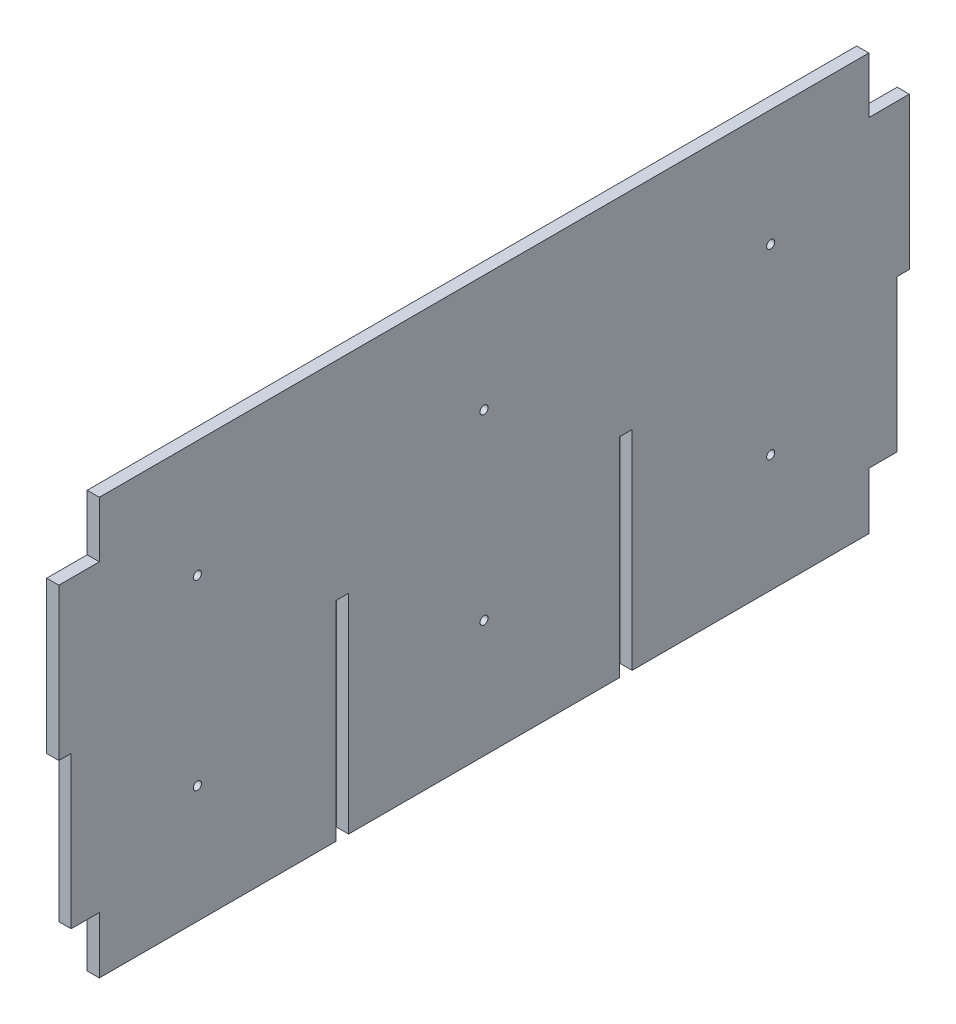
ISO-10303-21;
HEADER;
FILE_DESCRIPTION(('STEP AP214'),'2;1');
FILE_NAME('part.step','',(''),(''),'','','');
FILE_SCHEMA(('AUTOMOTIVE_DESIGN { 1 0 10303 214 1 1 1 1 }'));
ENDSEC;
DATA;
#1=APPLICATION_CONTEXT('core data for automotive mechanical design processes');
#2=APPLICATION_PROTOCOL_DEFINITION('international standard','automotive_design',2000,#1);
#3=PRODUCT_CONTEXT('',#1,'mechanical');
#4=PRODUCT('Part','Part','',(#3));
#5=PRODUCT_RELATED_PRODUCT_CATEGORY('part','',(#4));
#6=PRODUCT_DEFINITION_FORMATION('','',#4);
#7=PRODUCT_DEFINITION_CONTEXT('part definition',#1,'design');
#8=PRODUCT_DEFINITION('design','',#6,#7);
#9=PRODUCT_DEFINITION_SHAPE('','',#8);
#10=(LENGTH_UNIT() NAMED_UNIT(*) SI_UNIT(.MILLI.,.METRE.));
#11=(NAMED_UNIT(*) PLANE_ANGLE_UNIT() SI_UNIT($,.RADIAN.));
#12=(NAMED_UNIT(*) SI_UNIT($,.STERADIAN.) SOLID_ANGLE_UNIT());
#13=UNCERTAINTY_MEASURE_WITH_UNIT(LENGTH_MEASURE(1.E-05),#10,'distance_accuracy_value','');
#14=(GEOMETRIC_REPRESENTATION_CONTEXT(3) GLOBAL_UNCERTAINTY_ASSIGNED_CONTEXT((#13)) GLOBAL_UNIT_ASSIGNED_CONTEXT((#10,
#11,#12)) REPRESENTATION_CONTEXT('',''));
#15=CARTESIAN_POINT('',(0.,0.,0.));
#16=DIRECTION('',(0.,0.,1.));
#17=DIRECTION('',(1.,0.,0.));
#18=AXIS2_PLACEMENT_3D('',#15,#16,#17);
#19=CARTESIAN_POINT('',(6.,76.915861829284,-230.911700257926));
#20=DIRECTION('',(0.,0.,-1.));
#21=DIRECTION('',(-1.,0.,0.));
#22=AXIS2_PLACEMENT_3D('',#19,#20,#21);
#23=PLANE('',#22);
#24=DIRECTION('',(0.,-1.,0.));
#25=VECTOR('',#24,1.);
#26=CARTESIAN_POINT('',(6.,76.915861829284,-230.911700257926));
#27=LINE('',#26,#25);
#28=CARTESIAN_POINT('',(6.,236.915861829284,-230.911700257926));
#29=VERTEX_POINT('',#28);
#30=CARTESIAN_POINT('',(6.,161.915861829284,-230.911700257926));
#31=VERTEX_POINT('',#30);
#32=EDGE_CURVE('E282',#29,#31,#27,.T.);
#33=ORIENTED_EDGE('',*,*,#32,.F.);
#34=DIRECTION('',(1.,0.,0.));
#35=VECTOR('',#34,1.);
#36=CARTESIAN_POINT('',(-994.,236.915861829284,-230.911700257926));
#37=LINE('',#36,#35);
#38=CARTESIAN_POINT('',(0.,236.915861829284,-230.911700257926));
#39=VERTEX_POINT('',#38);
#40=EDGE_CURVE('E239',#39,#29,#37,.T.);
#41=ORIENTED_EDGE('',*,*,#40,.F.);
#42=DIRECTION('',(0.,-1.,0.));
#43=VECTOR('',#42,1.);
#44=CARTESIAN_POINT('',(0.,76.915861829284,-230.911700257926));
#45=LINE('',#44,#43);
#46=CARTESIAN_POINT('',(0.,161.915861829284,-230.911700257926));
#47=VERTEX_POINT('',#46);
#48=EDGE_CURVE('E262',#39,#47,#45,.T.);
#49=ORIENTED_EDGE('',*,*,#48,.T.);
#50=DIRECTION('',(1.,0.,0.));
#51=VECTOR('',#50,1.);
#52=CARTESIAN_POINT('',(0.,161.915861829284,-230.911700257926));
#53=LINE('',#52,#51);
#54=EDGE_CURVE('E277',#47,#31,#53,.T.);
#55=ORIENTED_EDGE('',*,*,#54,.T.);
#56=EDGE_LOOP('',(#33,#41,#49,#55));
#57=FACE_BOUND('',#56,.T.);
#58=ADVANCED_FACE('F32',(#57),#23,.F.);
#59=CARTESIAN_POINT('',(6.,76.915861829284,-650.911700257926));
#60=DIRECTION('',(0.,0.,1.));
#61=DIRECTION('',(1.,0.,0.));
#62=AXIS2_PLACEMENT_3D('',#59,#60,#61);
#63=PLANE('',#62);
#64=DIRECTION('',(0.,1.,0.));
#65=VECTOR('',#64,1.);
#66=CARTESIAN_POINT('',(0.,76.915861829284,-650.911700257926));
#67=LINE('',#66,#65);
#68=CARTESIAN_POINT('',(0.,161.915861829284,-650.911700257926));
#69=VERTEX_POINT('',#68);
#70=CARTESIAN_POINT('',(0.,236.915861829284,-650.911700257926));
#71=VERTEX_POINT('',#70);
#72=EDGE_CURVE('E273',#69,#71,#67,.T.);
#73=ORIENTED_EDGE('',*,*,#72,.T.);
#74=DIRECTION('',(1.,0.,0.));
#75=VECTOR('',#74,1.);
#76=CARTESIAN_POINT('',(-994.,236.915861829284,-650.911700257926));
#77=LINE('',#76,#75);
#78=CARTESIAN_POINT('',(6.,236.915861829284,-650.911700257926));
#79=VERTEX_POINT('',#78);
#80=EDGE_CURVE('E210',#71,#79,#77,.T.);
#81=ORIENTED_EDGE('',*,*,#80,.T.);
#82=DIRECTION('',(0.,1.,0.));
#83=VECTOR('',#82,1.);
#84=CARTESIAN_POINT('',(6.,76.915861829284,-650.911700257926));
#85=LINE('',#84,#83);
#86=CARTESIAN_POINT('',(6.,161.915861829284,-650.911700257926));
#87=VERTEX_POINT('',#86);
#88=EDGE_CURVE('E216',#87,#79,#85,.T.);
#89=ORIENTED_EDGE('',*,*,#88,.F.);
#90=DIRECTION('',(1.,0.,0.));
#91=VECTOR('',#90,1.);
#92=CARTESIAN_POINT('',(0.,161.915861829284,-650.911700257926));
#93=LINE('',#92,#91);
#94=EDGE_CURVE('E304',#69,#87,#93,.T.);
#95=ORIENTED_EDGE('',*,*,#94,.F.);
#96=EDGE_LOOP('',(#73,#81,#89,#95));
#97=FACE_BOUND('',#96,.T.);
#98=ADVANCED_FACE('F483',(#97),#63,.F.);
#99=CARTESIAN_POINT('',(6.,0.,0.));
#100=DIRECTION('',(-1.,0.,0.));
#101=DIRECTION('',(0.,0.,1.));
#102=AXIS2_PLACEMENT_3D('',#99,#100,#101);
#103=PLANE('',#102);
#104=DIRECTION('',(0.,0.,-1.));
#105=VECTOR('',#104,1.);
#106=CARTESIAN_POINT('',(6.,236.915861829284,-630.911700257926));
#107=LINE('',#106,#105);
#108=CARTESIAN_POINT('',(6.,236.915861829284,-630.911700257926));
#109=VERTEX_POINT('',#108);
#110=EDGE_CURVE('E207',#109,#79,#107,.T.);
#111=ORIENTED_EDGE('',*,*,#110,.F.);
#112=DIRECTION('',(0.,-1.,0.));
#113=VECTOR('',#112,1.);
#114=CARTESIAN_POINT('',(6.,274.915861829284,-630.911700257926));
#115=LINE('',#114,#113);
#116=CARTESIAN_POINT('',(6.,264.515338882501,-630.911700257926));
#117=VERTEX_POINT('',#116);
#118=EDGE_CURVE('E194',#117,#109,#115,.T.);
#119=ORIENTED_EDGE('',*,*,#118,.F.);
#120=DIRECTION('',(0.,0.,1.));
#121=VECTOR('',#120,1.);
#122=CARTESIAN_POINT('',(6.,264.515338882501,-1250.91170025793));
#123=LINE('',#122,#121);
#124=CARTESIAN_POINT('',(6.,264.515338882501,-250.911700257926));
#125=VERTEX_POINT('',#124);
#126=EDGE_CURVE('E276',#117,#125,#123,.T.);
#127=ORIENTED_EDGE('',*,*,#126,.T.);
#128=DIRECTION('',(0.,-1.,0.));
#129=VECTOR('',#128,1.);
#130=CARTESIAN_POINT('',(6.,274.915861829284,-250.911700257926));
#131=LINE('',#130,#129);
#132=CARTESIAN_POINT('',(6.,236.915861829284,-250.911700257926));
#133=VERTEX_POINT('',#132);
#134=EDGE_CURVE('E284',#125,#133,#131,.T.);
#135=ORIENTED_EDGE('',*,*,#134,.T.);
#136=DIRECTION('',(0.,0.,-1.));
#137=VECTOR('',#136,1.);
#138=CARTESIAN_POINT('',(6.,236.915861829284,-230.911700257926));
#139=LINE('',#138,#137);
#140=EDGE_CURVE('E236',#29,#133,#139,.T.);
#141=ORIENTED_EDGE('',*,*,#140,.F.);
#142=ORIENTED_EDGE('',*,*,#32,.T.);
#143=DIRECTION('',(0.,0.,1.));
#144=VECTOR('',#143,1.);
#145=CARTESIAN_POINT('',(6.,161.915861829284,-230.911700257926));
#146=LINE('',#145,#144);
#147=CARTESIAN_POINT('',(6.,161.915861829284,-237.011700257926));
#148=VERTEX_POINT('',#147);
#149=EDGE_CURVE('E289',#148,#31,#146,.T.);
#150=ORIENTED_EDGE('',*,*,#149,.F.);
#151=DIRECTION('',(0.,1.,0.));
#152=VECTOR('',#151,1.);
#153=CARTESIAN_POINT('',(6.,161.915861829284,-237.011700257926));
#154=LINE('',#153,#152);
#155=CARTESIAN_POINT('',(6.,86.915861829284,-237.011700257926));
#156=VERTEX_POINT('',#155);
#157=EDGE_CURVE('E288',#156,#148,#154,.T.);
#158=ORIENTED_EDGE('',*,*,#157,.F.);
#159=DIRECTION('',(0.,0.,1.));
#160=VECTOR('',#159,1.);
#161=CARTESIAN_POINT('',(6.,86.915861829284,-237.011700257926));
#162=LINE('',#161,#160);
#163=CARTESIAN_POINT('',(6.,86.915861829284,-250.911700257926));
#164=VERTEX_POINT('',#163);
#165=EDGE_CURVE('E220',#164,#156,#162,.T.);
#166=ORIENTED_EDGE('',*,*,#165,.F.);
#167=DIRECTION('',(0.,1.,0.));
#168=VECTOR('',#167,1.);
#169=CARTESIAN_POINT('',(6.,46.915861829284,-250.911700257926));
#170=LINE('',#169,#168);
#171=CARTESIAN_POINT('',(6.,58.9158618292841,-250.911700257926));
#172=VERTEX_POINT('',#171);
#173=EDGE_CURVE('E341',#172,#164,#170,.T.);
#174=ORIENTED_EDGE('',*,*,#173,.F.);
#175=DIRECTION('',(0.,0.,1.));
#176=VECTOR('',#175,1.);
#177=CARTESIAN_POINT('',(6.,58.9158618292841,-1250.91170025793));
#178=LINE('',#177,#176);
#179=CARTESIAN_POINT('',(6.,58.9158618292841,-367.811700257926));
#180=VERTEX_POINT('',#179);
#181=EDGE_CURVE('E246',#180,#172,#178,.T.);
#182=ORIENTED_EDGE('',*,*,#181,.F.);
#183=DIRECTION('',(0.,-1.,0.));
#184=VECTOR('',#183,1.);
#185=CARTESIAN_POINT('',(6.,48.915861829284,-367.811700257926));
#186=LINE('',#185,#184);
#187=CARTESIAN_POINT('',(6.,161.915861829284,-367.811700257926));
#188=VERTEX_POINT('',#187);
#189=EDGE_CURVE('E272',#188,#180,#186,.T.);
#190=ORIENTED_EDGE('',*,*,#189,.F.);
#191=DIRECTION('',(0.,0.,1.));
#192=VECTOR('',#191,1.);
#193=CARTESIAN_POINT('',(6.,161.915861829284,-367.811700257926));
#194=LINE('',#193,#192);
#195=CARTESIAN_POINT('',(6.,161.915861829284,-374.011700257926));
#196=VERTEX_POINT('',#195);
#197=EDGE_CURVE('E365',#196,#188,#194,.T.);
#198=ORIENTED_EDGE('',*,*,#197,.F.);
#199=DIRECTION('',(0.,1.,0.));
#200=VECTOR('',#199,1.);
#201=CARTESIAN_POINT('',(6.,48.915861829284,-374.011700257926));
#202=LINE('',#201,#200);
#203=CARTESIAN_POINT('',(6.,58.9158618292841,-374.011700257926));
#204=VERTEX_POINT('',#203);
#205=EDGE_CURVE('E364',#204,#196,#202,.T.);
#206=ORIENTED_EDGE('',*,*,#205,.F.);
#207=CARTESIAN_POINT('',(6.,58.9158618292841,-507.811700257926));
#208=VERTEX_POINT('',#207);
#209=EDGE_CURVE('E251',#208,#204,#178,.T.);
#210=ORIENTED_EDGE('',*,*,#209,.F.);
#211=DIRECTION('',(0.,-1.,0.));
#212=VECTOR('',#211,1.);
#213=CARTESIAN_POINT('',(6.,48.915861829284,-507.811700257926));
#214=LINE('',#213,#212);
#215=CARTESIAN_POINT('',(6.,161.915861829284,-507.811700257926));
#216=VERTEX_POINT('',#215);
#217=EDGE_CURVE('E268',#216,#208,#214,.T.);
#218=ORIENTED_EDGE('',*,*,#217,.F.);
#219=DIRECTION('',(0.,0.,1.));
#220=VECTOR('',#219,1.);
#221=CARTESIAN_POINT('',(6.,161.915861829284,-507.811700257926));
#222=LINE('',#221,#220);
#223=CARTESIAN_POINT('',(6.,161.915861829284,-514.011700257926));
#224=VERTEX_POINT('',#223);
#225=EDGE_CURVE('E381',#224,#216,#222,.T.);
#226=ORIENTED_EDGE('',*,*,#225,.F.);
#227=DIRECTION('',(0.,1.,0.));
#228=VECTOR('',#227,1.);
#229=CARTESIAN_POINT('',(6.,48.915861829284,-514.011700257926));
#230=LINE('',#229,#228);
#231=CARTESIAN_POINT('',(6.,58.9158618292841,-514.011700257926));
#232=VERTEX_POINT('',#231);
#233=EDGE_CURVE('E380',#232,#224,#230,.T.);
#234=ORIENTED_EDGE('',*,*,#233,.F.);
#235=CARTESIAN_POINT('',(6.,58.9158618292841,-630.911700257926));
#236=VERTEX_POINT('',#235);
#237=EDGE_CURVE('E248',#236,#232,#178,.T.);
#238=ORIENTED_EDGE('',*,*,#237,.F.);
#239=DIRECTION('',(0.,1.,0.));
#240=VECTOR('',#239,1.);
#241=CARTESIAN_POINT('',(6.00000000000005,46.915861829284,-630.911700257926));
#242=LINE('',#241,#240);
#243=CARTESIAN_POINT('',(6.,86.915861829284,-630.911700257926));
#244=VERTEX_POINT('',#243);
#245=EDGE_CURVE('E281',#236,#244,#242,.T.);
#246=ORIENTED_EDGE('',*,*,#245,.T.);
#247=DIRECTION('',(0.,0.,1.));
#248=VECTOR('',#247,1.);
#249=CARTESIAN_POINT('',(6.,86.915861829284,-630.911700257926));
#250=LINE('',#249,#248);
#251=CARTESIAN_POINT('',(6.,86.915861829284,-644.811700257926));
#252=VERTEX_POINT('',#251);
#253=EDGE_CURVE('E227',#252,#244,#250,.T.);
#254=ORIENTED_EDGE('',*,*,#253,.F.);
#255=DIRECTION('',(0.,-1.,0.));
#256=VECTOR('',#255,1.);
#257=CARTESIAN_POINT('',(6.,161.915861829284,-644.811700257926));
#258=LINE('',#257,#256);
#259=CARTESIAN_POINT('',(6.,161.915861829284,-644.811700257926));
#260=VERTEX_POINT('',#259);
#261=EDGE_CURVE('E296',#260,#252,#258,.T.);
#262=ORIENTED_EDGE('',*,*,#261,.F.);
#263=DIRECTION('',(0.,0.,1.));
#264=VECTOR('',#263,1.);
#265=CARTESIAN_POINT('',(6.,161.915861829284,-650.911700257926));
#266=LINE('',#265,#264);
#267=EDGE_CURVE('E307',#87,#260,#266,.T.);
#268=ORIENTED_EDGE('',*,*,#267,.F.);
#269=ORIENTED_EDGE('',*,*,#88,.T.);
#270=EDGE_LOOP('',(#111,#119,#127,#135,#141,#142,#150,#158,#166,#174,#182,#190,#198,#206,#210,
#218,#226,#234,#238,#246,#254,#262,#268,#269));
#271=FACE_BOUND('',#270,.T.);
#272=CARTESIAN_POINT('',(6.,116.915861829284,-440.911700257926));
#273=DIRECTION('',(1.,0.,0.));
#274=DIRECTION('',(0.,0.,-1.));
#275=AXIS2_PLACEMENT_3D('',#272,#273,#274);
#276=CIRCLE('',#275,2.);
#277=CARTESIAN_POINT('',(6.,116.915861829284,-442.911700257926));
#278=VERTEX_POINT('',#277);
#279=EDGE_CURVE('E338',#278,#278,#276,.T.);
#280=ORIENTED_EDGE('',*,*,#279,.F.);
#281=EDGE_LOOP('',(#280));
#282=FACE_BOUND('',#281,.T.);
#283=CARTESIAN_POINT('',(6.,116.915861829284,-582.461700257926));
#284=DIRECTION('',(1.,0.,0.));
#285=DIRECTION('',(0.,0.,-1.));
#286=AXIS2_PLACEMENT_3D('',#283,#284,#285);
#287=CIRCLE('',#286,2.);
#288=CARTESIAN_POINT('',(6.,116.915861829284,-584.461700257926));
#289=VERTEX_POINT('',#288);
#290=EDGE_CURVE('E342',#289,#289,#287,.T.);
#291=ORIENTED_EDGE('',*,*,#290,.F.);
#292=EDGE_LOOP('',(#291));
#293=FACE_BOUND('',#292,.T.);
#294=CARTESIAN_POINT('',(6.,206.915861829284,-582.461700257926));
#295=DIRECTION('',(1.,0.,0.));
#296=DIRECTION('',(0.,0.,-1.));
#297=AXIS2_PLACEMENT_3D('',#294,#295,#296);
#298=CIRCLE('',#297,2.);
#299=CARTESIAN_POINT('',(6.,206.915861829284,-584.461700257926));
#300=VERTEX_POINT('',#299);
#301=EDGE_CURVE('E329',#300,#300,#298,.T.);
#302=ORIENTED_EDGE('',*,*,#301,.F.);
#303=EDGE_LOOP('',(#302));
#304=FACE_BOUND('',#303,.T.);
#305=CARTESIAN_POINT('',(6.,206.915861829284,-440.911700257926));
#306=DIRECTION('',(1.,0.,0.));
#307=DIRECTION('',(0.,0.,-1.));
#308=AXIS2_PLACEMENT_3D('',#305,#306,#307);
#309=CIRCLE('',#308,2.);
#310=CARTESIAN_POINT('',(6.,206.915861829284,-442.911700257926));
#311=VERTEX_POINT('',#310);
#312=EDGE_CURVE('E326',#311,#311,#309,.T.);
#313=ORIENTED_EDGE('',*,*,#312,.F.);
#314=EDGE_LOOP('',(#313));
#315=FACE_BOUND('',#314,.T.);
#316=CARTESIAN_POINT('',(6.,116.915861829284,-299.361700257926));
#317=DIRECTION('',(1.,0.,0.));
#318=DIRECTION('',(0.,0.,-1.));
#319=AXIS2_PLACEMENT_3D('',#316,#317,#318);
#320=CIRCLE('',#319,2.);
#321=CARTESIAN_POINT('',(6.,116.915861829284,-301.361700257926));
#322=VERTEX_POINT('',#321);
#323=EDGE_CURVE('E322',#322,#322,#320,.T.);
#324=ORIENTED_EDGE('',*,*,#323,.F.);
#325=EDGE_LOOP('',(#324));
#326=FACE_BOUND('',#325,.T.);
#327=CARTESIAN_POINT('',(6.,206.915861829284,-299.361700257926));
#328=DIRECTION('',(1.,0.,0.));
#329=DIRECTION('',(0.,0.,-1.));
#330=AXIS2_PLACEMENT_3D('',#327,#328,#329);
#331=CIRCLE('',#330,2.);
#332=CARTESIAN_POINT('',(6.,206.915861829284,-301.361700257926));
#333=VERTEX_POINT('',#332);
#334=EDGE_CURVE('E306',#333,#333,#331,.T.);
#335=ORIENTED_EDGE('',*,*,#334,.F.);
#336=EDGE_LOOP('',(#335));
#337=FACE_BOUND('',#336,.T.);
#338=ADVANCED_FACE('F34',(#271,#282,#293,#304,#315,#326,#337),#103,.F.);
#339=CARTESIAN_POINT('',(0.,0.,0.));
#340=DIRECTION('',(-1.,0.,0.));
#341=DIRECTION('',(0.,0.,1.));
#342=AXIS2_PLACEMENT_3D('',#339,#340,#341);
#343=PLANE('',#342);
#344=DIRECTION('',(0.,-1.,0.));
#345=VECTOR('',#344,1.);
#346=CARTESIAN_POINT('',(0.,274.915861829284,-630.911700257926));
#347=LINE('',#346,#345);
#348=CARTESIAN_POINT('',(0.,264.515338882501,-630.911700257926));
#349=VERTEX_POINT('',#348);
#350=CARTESIAN_POINT('',(0.,236.915861829284,-630.911700257926));
#351=VERTEX_POINT('',#350);
#352=EDGE_CURVE('E280',#349,#351,#347,.T.);
#353=ORIENTED_EDGE('',*,*,#352,.T.);
#354=DIRECTION('',(0.,0.,1.));
#355=VECTOR('',#354,1.);
#356=CARTESIAN_POINT('',(0.,236.915861829284,0.));
#357=LINE('',#356,#355);
#358=EDGE_CURVE('E11',#71,#351,#357,.T.);
#359=ORIENTED_EDGE('',*,*,#358,.F.);
#360=ORIENTED_EDGE('',*,*,#72,.F.);
#361=DIRECTION('',(0.,0.,1.));
#362=VECTOR('',#361,1.);
#363=CARTESIAN_POINT('',(0.,161.915861829284,-650.911700257926));
#364=LINE('',#363,#362);
#365=CARTESIAN_POINT('',(0.,161.915861829284,-644.811700257926));
#366=VERTEX_POINT('',#365);
#367=EDGE_CURVE('E317',#69,#366,#364,.T.);
#368=ORIENTED_EDGE('',*,*,#367,.T.);
#369=DIRECTION('',(0.,-1.,0.));
#370=VECTOR('',#369,1.);
#371=CARTESIAN_POINT('',(0.,161.915861829284,-644.811700257926));
#372=LINE('',#371,#370);
#373=CARTESIAN_POINT('',(0.,86.915861829284,-644.811700257926));
#374=VERTEX_POINT('',#373);
#375=EDGE_CURVE('E314',#366,#374,#372,.T.);
#376=ORIENTED_EDGE('',*,*,#375,.T.);
#377=DIRECTION('',(0.,0.,-1.));
#378=VECTOR('',#377,1.);
#379=CARTESIAN_POINT('',(0.,86.915861829284,0.));
#380=LINE('',#379,#378);
#381=CARTESIAN_POINT('',(0.,86.915861829284,-630.911700257926));
#382=VERTEX_POINT('',#381);
#383=EDGE_CURVE('E223',#382,#374,#380,.T.);
#384=ORIENTED_EDGE('',*,*,#383,.F.);
#385=DIRECTION('',(0.,1.,0.));
#386=VECTOR('',#385,1.);
#387=CARTESIAN_POINT('',(0.,46.915861829284,-630.911700257926));
#388=LINE('',#387,#386);
#389=CARTESIAN_POINT('',(0.,58.9158618292841,-630.911700257926));
#390=VERTEX_POINT('',#389);
#391=EDGE_CURVE('E355',#390,#382,#388,.T.);
#392=ORIENTED_EDGE('',*,*,#391,.F.);
#393=DIRECTION('',(0.,0.,1.));
#394=VECTOR('',#393,1.);
#395=CARTESIAN_POINT('',(0.,58.9158618292841,-1250.91170025793));
#396=LINE('',#395,#394);
#397=CARTESIAN_POINT('',(0.,58.9158618292841,-514.011700257926));
#398=VERTEX_POINT('',#397);
#399=EDGE_CURVE('E249',#390,#398,#396,.T.);
#400=ORIENTED_EDGE('',*,*,#399,.T.);
#401=DIRECTION('',(0.,-1.,0.));
#402=VECTOR('',#401,1.);
#403=CARTESIAN_POINT('',(0.,0.,-514.011700257926));
#404=LINE('',#403,#402);
#405=CARTESIAN_POINT('',(0.,161.915861829284,-514.011700257926));
#406=VERTEX_POINT('',#405);
#407=EDGE_CURVE('E377',#406,#398,#404,.T.);
#408=ORIENTED_EDGE('',*,*,#407,.F.);
#409=DIRECTION('',(0.,0.,-1.));
#410=VECTOR('',#409,1.);
#411=CARTESIAN_POINT('',(0.,161.915861829284,0.));
#412=LINE('',#411,#410);
#413=CARTESIAN_POINT('',(0.,161.915861829284,-507.811700257926));
#414=VERTEX_POINT('',#413);
#415=EDGE_CURVE('E265',#414,#406,#412,.T.);
#416=ORIENTED_EDGE('',*,*,#415,.F.);
#417=DIRECTION('',(0.,1.,0.));
#418=VECTOR('',#417,1.);
#419=CARTESIAN_POINT('',(0.,0.,-507.811700257926));
#420=LINE('',#419,#418);
#421=CARTESIAN_POINT('',(0.,58.9158618292841,-507.811700257926));
#422=VERTEX_POINT('',#421);
#423=EDGE_CURVE('E372',#422,#414,#420,.T.);
#424=ORIENTED_EDGE('',*,*,#423,.F.);
#425=CARTESIAN_POINT('',(0.,58.9158618292841,-374.011700257926));
#426=VERTEX_POINT('',#425);
#427=EDGE_CURVE('E55',#422,#426,#396,.T.);
#428=ORIENTED_EDGE('',*,*,#427,.T.);
#429=DIRECTION('',(0.,-1.,0.));
#430=VECTOR('',#429,1.);
#431=CARTESIAN_POINT('',(0.,0.,-374.011700257926));
#432=LINE('',#431,#430);
#433=CARTESIAN_POINT('',(0.,161.915861829284,-374.011700257926));
#434=VERTEX_POINT('',#433);
#435=EDGE_CURVE('E361',#434,#426,#432,.T.);
#436=ORIENTED_EDGE('',*,*,#435,.F.);
#437=DIRECTION('',(0.,0.,-1.));
#438=VECTOR('',#437,1.);
#439=CARTESIAN_POINT('',(0.,161.915861829284,0.));
#440=LINE('',#439,#438);
#441=CARTESIAN_POINT('',(0.,161.915861829284,-367.811700257926));
#442=VERTEX_POINT('',#441);
#443=EDGE_CURVE('E269',#442,#434,#440,.T.);
#444=ORIENTED_EDGE('',*,*,#443,.F.);
#445=DIRECTION('',(0.,1.,0.));
#446=VECTOR('',#445,1.);
#447=CARTESIAN_POINT('',(0.,0.,-367.811700257926));
#448=LINE('',#447,#446);
#449=CARTESIAN_POINT('',(0.,58.9158618292841,-367.811700257926));
#450=VERTEX_POINT('',#449);
#451=EDGE_CURVE('E203',#450,#442,#448,.T.);
#452=ORIENTED_EDGE('',*,*,#451,.F.);
#453=CARTESIAN_POINT('',(0.,58.9158618292841,-250.911700257926));
#454=VERTEX_POINT('',#453);
#455=EDGE_CURVE('E47',#450,#454,#396,.T.);
#456=ORIENTED_EDGE('',*,*,#455,.T.);
#457=DIRECTION('',(0.,1.,0.));
#458=VECTOR('',#457,1.);
#459=CARTESIAN_POINT('',(0.,46.915861829284,-250.911700257926));
#460=LINE('',#459,#458);
#461=CARTESIAN_POINT('',(0.,86.915861829284,-250.911700257926));
#462=VERTEX_POINT('',#461);
#463=EDGE_CURVE('E303',#454,#462,#460,.T.);
#464=ORIENTED_EDGE('',*,*,#463,.T.);
#465=DIRECTION('',(0.,0.,-1.));
#466=VECTOR('',#465,1.);
#467=CARTESIAN_POINT('',(0.,86.915861829284,0.));
#468=LINE('',#467,#466);
#469=CARTESIAN_POINT('',(0.,86.915861829284,-237.011700257926));
#470=VERTEX_POINT('',#469);
#471=EDGE_CURVE('E233',#470,#462,#468,.T.);
#472=ORIENTED_EDGE('',*,*,#471,.F.);
#473=DIRECTION('',(0.,1.,0.));
#474=VECTOR('',#473,1.);
#475=CARTESIAN_POINT('',(0.,161.915861829284,-237.011700257926));
#476=LINE('',#475,#474);
#477=CARTESIAN_POINT('',(0.,161.915861829284,-237.011700257926));
#478=VERTEX_POINT('',#477);
#479=EDGE_CURVE('E301',#470,#478,#476,.T.);
#480=ORIENTED_EDGE('',*,*,#479,.T.);
#481=DIRECTION('',(0.,0.,1.));
#482=VECTOR('',#481,1.);
#483=CARTESIAN_POINT('',(0.,161.915861829284,-230.911700257926));
#484=LINE('',#483,#482);
#485=EDGE_CURVE('E297',#478,#47,#484,.T.);
#486=ORIENTED_EDGE('',*,*,#485,.T.);
#487=ORIENTED_EDGE('',*,*,#48,.F.);
#488=DIRECTION('',(0.,0.,1.));
#489=VECTOR('',#488,1.);
#490=CARTESIAN_POINT('',(0.,236.915861829284,0.));
#491=LINE('',#490,#489);
#492=CARTESIAN_POINT('',(0.,236.915861829284,-250.911700257926));
#493=VERTEX_POINT('',#492);
#494=EDGE_CURVE('E401',#493,#39,#491,.T.);
#495=ORIENTED_EDGE('',*,*,#494,.F.);
#496=DIRECTION('',(0.,-1.,0.));
#497=VECTOR('',#496,1.);
#498=CARTESIAN_POINT('',(0.,274.915861829284,-250.911700257926));
#499=LINE('',#498,#497);
#500=CARTESIAN_POINT('',(0.,264.515338882501,-250.911700257926));
#501=VERTEX_POINT('',#500);
#502=EDGE_CURVE('E264',#501,#493,#499,.T.);
#503=ORIENTED_EDGE('',*,*,#502,.F.);
#504=DIRECTION('',(0.,0.,1.));
#505=VECTOR('',#504,1.);
#506=CARTESIAN_POINT('',(0.,264.515338882501,-1250.91170025793));
#507=LINE('',#506,#505);
#508=EDGE_CURVE('E388',#349,#501,#507,.T.);
#509=ORIENTED_EDGE('',*,*,#508,.F.);
#510=EDGE_LOOP('',(#353,#359,#360,#368,#376,#384,#392,#400,#408,#416,#424,#428,#436,#444,#452,
#456,#464,#472,#480,#486,#487,#495,#503,#509));
#511=FACE_BOUND('',#510,.T.);
#512=CARTESIAN_POINT('',(0.,116.915861829284,-440.911700257926));
#513=DIRECTION('',(1.,0.,0.));
#514=DIRECTION('',(0.,0.,-1.));
#515=AXIS2_PLACEMENT_3D('',#512,#513,#514);
#516=CIRCLE('',#515,2.);
#517=CARTESIAN_POINT('',(0.,116.915861829284,-442.911700257926));
#518=VERTEX_POINT('',#517);
#519=EDGE_CURVE('E300',#518,#518,#516,.T.);
#520=ORIENTED_EDGE('',*,*,#519,.T.);
#521=EDGE_LOOP('',(#520));
#522=FACE_BOUND('',#521,.T.);
#523=CARTESIAN_POINT('',(0.,116.915861829284,-582.461700257926));
#524=DIRECTION('',(1.,0.,0.));
#525=DIRECTION('',(0.,0.,-1.));
#526=AXIS2_PLACEMENT_3D('',#523,#524,#525);
#527=CIRCLE('',#526,2.);
#528=CARTESIAN_POINT('',(0.,116.915861829284,-584.461700257926));
#529=VERTEX_POINT('',#528);
#530=EDGE_CURVE('E345',#529,#529,#527,.T.);
#531=ORIENTED_EDGE('',*,*,#530,.T.);
#532=EDGE_LOOP('',(#531));
#533=FACE_BOUND('',#532,.T.);
#534=CARTESIAN_POINT('',(0.,206.915861829284,-582.461700257926));
#535=DIRECTION('',(1.,0.,0.));
#536=DIRECTION('',(0.,0.,-1.));
#537=AXIS2_PLACEMENT_3D('',#534,#535,#536);
#538=CIRCLE('',#537,2.);
#539=CARTESIAN_POINT('',(0.,206.915861829284,-584.461700257926));
#540=VERTEX_POINT('',#539);
#541=EDGE_CURVE('E333',#540,#540,#538,.T.);
#542=ORIENTED_EDGE('',*,*,#541,.T.);
#543=EDGE_LOOP('',(#542));
#544=FACE_BOUND('',#543,.T.);
#545=CARTESIAN_POINT('',(0.,206.915861829284,-440.911700257926));
#546=DIRECTION('',(1.,0.,0.));
#547=DIRECTION('',(0.,0.,-1.));
#548=AXIS2_PLACEMENT_3D('',#545,#546,#547);
#549=CIRCLE('',#548,2.);
#550=CARTESIAN_POINT('',(0.,206.915861829284,-442.911700257926));
#551=VERTEX_POINT('',#550);
#552=EDGE_CURVE('E330',#551,#551,#549,.T.);
#553=ORIENTED_EDGE('',*,*,#552,.T.);
#554=EDGE_LOOP('',(#553));
#555=FACE_BOUND('',#554,.T.);
#556=CARTESIAN_POINT('',(0.,116.915861829284,-299.361700257926));
#557=DIRECTION('',(1.,0.,0.));
#558=DIRECTION('',(0.,0.,-1.));
#559=AXIS2_PLACEMENT_3D('',#556,#557,#558);
#560=CIRCLE('',#559,2.);
#561=CARTESIAN_POINT('',(0.,116.915861829284,-301.361700257926));
#562=VERTEX_POINT('',#561);
#563=EDGE_CURVE('E325',#562,#562,#560,.T.);
#564=ORIENTED_EDGE('',*,*,#563,.T.);
#565=EDGE_LOOP('',(#564));
#566=FACE_BOUND('',#565,.T.);
#567=CARTESIAN_POINT('',(0.,206.915861829284,-299.361700257926));
#568=DIRECTION('',(1.,0.,0.));
#569=DIRECTION('',(0.,0.,-1.));
#570=AXIS2_PLACEMENT_3D('',#567,#568,#569);
#571=CIRCLE('',#570,2.);
#572=CARTESIAN_POINT('',(0.,206.915861829284,-301.361700257926));
#573=VERTEX_POINT('',#572);
#574=EDGE_CURVE('E294',#573,#573,#571,.T.);
#575=ORIENTED_EDGE('',*,*,#574,.T.);
#576=EDGE_LOOP('',(#575));
#577=FACE_BOUND('',#576,.T.);
#578=ADVANCED_FACE('F427',(#511,#522,#533,#544,#555,#566,#577),#343,.T.);
#579=CARTESIAN_POINT('',(0.,161.915861829284,-230.911700257926));
#580=DIRECTION('',(0.,1.,0.));
#581=DIRECTION('',(0.,0.,1.));
#582=AXIS2_PLACEMENT_3D('',#579,#580,#581);
#583=PLANE('',#582);
#584=ORIENTED_EDGE('',*,*,#149,.T.);
#585=ORIENTED_EDGE('',*,*,#54,.F.);
#586=ORIENTED_EDGE('',*,*,#485,.F.);
#587=DIRECTION('',(1.,0.,0.));
#588=VECTOR('',#587,1.);
#589=CARTESIAN_POINT('',(0.,161.915861829284,-237.011700257926));
#590=LINE('',#589,#588);
#591=EDGE_CURVE('E285',#478,#148,#590,.T.);
#592=ORIENTED_EDGE('',*,*,#591,.T.);
#593=EDGE_LOOP('',(#584,#585,#586,#592));
#594=FACE_BOUND('',#593,.T.);
#595=ADVANCED_FACE('F420',(#594),#583,.F.);
#596=CARTESIAN_POINT('',(0.,161.915861829284,-237.011700257926));
#597=DIRECTION('',(0.,0.,-1.));
#598=DIRECTION('',(0.,1.,0.));
#599=AXIS2_PLACEMENT_3D('',#596,#597,#598);
#600=PLANE('',#599);
#601=ORIENTED_EDGE('',*,*,#479,.F.);
#602=DIRECTION('',(1.,0.,0.));
#603=VECTOR('',#602,1.);
#604=CARTESIAN_POINT('',(0.,86.915861829284,-237.011700257926));
#605=LINE('',#604,#603);
#606=EDGE_CURVE('E40',#470,#156,#605,.T.);
#607=ORIENTED_EDGE('',*,*,#606,.T.);
#608=ORIENTED_EDGE('',*,*,#157,.T.);
#609=ORIENTED_EDGE('',*,*,#591,.F.);
#610=EDGE_LOOP('',(#601,#607,#608,#609));
#611=FACE_BOUND('',#610,.T.);
#612=ADVANCED_FACE('F409',(#611),#600,.F.);
#613=CARTESIAN_POINT('',(0.,161.915861829284,-644.811700257926));
#614=DIRECTION('',(0.,0.,1.));
#615=DIRECTION('',(1.,0.,0.));
#616=AXIS2_PLACEMENT_3D('',#613,#614,#615);
#617=PLANE('',#616);
#618=ORIENTED_EDGE('',*,*,#261,.T.);
#619=DIRECTION('',(-1.,0.,0.));
#620=VECTOR('',#619,1.);
#621=CARTESIAN_POINT('',(0.,86.915861829284,-644.811700257926));
#622=LINE('',#621,#620);
#623=EDGE_CURVE('E403',#252,#374,#622,.T.);
#624=ORIENTED_EDGE('',*,*,#623,.T.);
#625=ORIENTED_EDGE('',*,*,#375,.F.);
#626=DIRECTION('',(1.,0.,0.));
#627=VECTOR('',#626,1.);
#628=CARTESIAN_POINT('',(0.,161.915861829284,-644.811700257926));
#629=LINE('',#628,#627);
#630=EDGE_CURVE('E308',#366,#260,#629,.T.);
#631=ORIENTED_EDGE('',*,*,#630,.T.);
#632=EDGE_LOOP('',(#618,#624,#625,#631));
#633=FACE_BOUND('',#632,.T.);
#634=ADVANCED_FACE('F497',(#633),#617,.F.);
#635=CARTESIAN_POINT('',(0.,161.915861829284,-650.911700257926));
#636=DIRECTION('',(0.,1.,0.));
#637=DIRECTION('',(0.,0.,1.));
#638=AXIS2_PLACEMENT_3D('',#635,#636,#637);
#639=PLANE('',#638);
#640=ORIENTED_EDGE('',*,*,#267,.T.);
#641=ORIENTED_EDGE('',*,*,#630,.F.);
#642=ORIENTED_EDGE('',*,*,#367,.F.);
#643=ORIENTED_EDGE('',*,*,#94,.T.);
#644=EDGE_LOOP('',(#640,#641,#642,#643));
#645=FACE_BOUND('',#644,.T.);
#646=ADVANCED_FACE('F500',(#645),#639,.F.);
#647=CARTESIAN_POINT('',(0.,206.915861829284,-299.361700257926));
#648=DIRECTION('',(1.,0.,0.));
#649=DIRECTION('',(0.,0.,-1.));
#650=AXIS2_PLACEMENT_3D('',#647,#648,#649);
#651=CYLINDRICAL_SURFACE('',#650,2.);
#652=ORIENTED_EDGE('',*,*,#574,.F.);
#653=EDGE_LOOP('',(#652));
#654=FACE_BOUND('',#653,.T.);
#655=ORIENTED_EDGE('',*,*,#334,.T.);
#656=EDGE_LOOP('',(#655));
#657=FACE_BOUND('',#656,.T.);
#658=ADVANCED_FACE('F503',(#654,#657),#651,.F.);
#659=CARTESIAN_POINT('',(0.,116.915861829284,-299.361700257926));
#660=DIRECTION('',(1.,0.,0.));
#661=DIRECTION('',(0.,0.,-1.));
#662=AXIS2_PLACEMENT_3D('',#659,#660,#661);
#663=CYLINDRICAL_SURFACE('',#662,2.);
#664=ORIENTED_EDGE('',*,*,#563,.F.);
#665=EDGE_LOOP('',(#664));
#666=FACE_BOUND('',#665,.T.);
#667=ORIENTED_EDGE('',*,*,#323,.T.);
#668=EDGE_LOOP('',(#667));
#669=FACE_BOUND('',#668,.T.);
#670=ADVANCED_FACE('F510',(#666,#669),#663,.F.);
#671=CARTESIAN_POINT('',(0.,206.915861829284,-440.911700257926));
#672=DIRECTION('',(1.,0.,0.));
#673=DIRECTION('',(0.,0.,-1.));
#674=AXIS2_PLACEMENT_3D('',#671,#672,#673);
#675=CYLINDRICAL_SURFACE('',#674,2.);
#676=ORIENTED_EDGE('',*,*,#552,.F.);
#677=EDGE_LOOP('',(#676));
#678=FACE_BOUND('',#677,.T.);
#679=ORIENTED_EDGE('',*,*,#312,.T.);
#680=EDGE_LOOP('',(#679));
#681=FACE_BOUND('',#680,.T.);
#682=ADVANCED_FACE('F512',(#678,#681),#675,.F.);
#683=CARTESIAN_POINT('',(0.,206.915861829284,-582.461700257926));
#684=DIRECTION('',(1.,0.,0.));
#685=DIRECTION('',(0.,0.,-1.));
#686=AXIS2_PLACEMENT_3D('',#683,#684,#685);
#687=CYLINDRICAL_SURFACE('',#686,2.);
#688=ORIENTED_EDGE('',*,*,#541,.F.);
#689=EDGE_LOOP('',(#688));
#690=FACE_BOUND('',#689,.T.);
#691=ORIENTED_EDGE('',*,*,#301,.T.);
#692=EDGE_LOOP('',(#691));
#693=FACE_BOUND('',#692,.T.);
#694=ADVANCED_FACE('F515',(#690,#693),#687,.F.);
#695=CARTESIAN_POINT('',(0.,116.915861829284,-582.461700257926));
#696=DIRECTION('',(1.,0.,0.));
#697=DIRECTION('',(0.,0.,-1.));
#698=AXIS2_PLACEMENT_3D('',#695,#696,#697);
#699=CYLINDRICAL_SURFACE('',#698,2.);
#700=ORIENTED_EDGE('',*,*,#530,.F.);
#701=EDGE_LOOP('',(#700));
#702=FACE_BOUND('',#701,.T.);
#703=ORIENTED_EDGE('',*,*,#290,.T.);
#704=EDGE_LOOP('',(#703));
#705=FACE_BOUND('',#704,.T.);
#706=ADVANCED_FACE('F523',(#702,#705),#699,.F.);
#707=CARTESIAN_POINT('',(0.,116.915861829284,-440.911700257926));
#708=DIRECTION('',(1.,0.,0.));
#709=DIRECTION('',(0.,0.,-1.));
#710=AXIS2_PLACEMENT_3D('',#707,#708,#709);
#711=CYLINDRICAL_SURFACE('',#710,2.);
#712=ORIENTED_EDGE('',*,*,#519,.F.);
#713=EDGE_LOOP('',(#712));
#714=FACE_BOUND('',#713,.T.);
#715=ORIENTED_EDGE('',*,*,#279,.T.);
#716=EDGE_LOOP('',(#715));
#717=FACE_BOUND('',#716,.T.);
#718=ADVANCED_FACE('F520',(#714,#717),#711,.F.);
#719=CARTESIAN_POINT('',(6.,46.915861829284,-250.911700257926));
#720=DIRECTION('',(0.,0.,-1.));
#721=DIRECTION('',(0.,1.,0.));
#722=AXIS2_PLACEMENT_3D('',#719,#720,#721);
#723=PLANE('',#722);
#724=ORIENTED_EDGE('',*,*,#463,.F.);
#725=DIRECTION('',(-1.,0.,0.));
#726=VECTOR('',#725,1.);
#727=CARTESIAN_POINT('',(6.,58.9158618292841,-250.911700257926));
#728=LINE('',#727,#726);
#729=EDGE_CURVE('E243',#172,#454,#728,.T.);
#730=ORIENTED_EDGE('',*,*,#729,.F.);
#731=ORIENTED_EDGE('',*,*,#173,.T.);
#732=DIRECTION('',(1.,0.,0.));
#733=VECTOR('',#732,1.);
#734=CARTESIAN_POINT('',(-994.,86.915861829284,-250.911700257926));
#735=LINE('',#734,#733);
#736=EDGE_CURVE('E217',#462,#164,#735,.T.);
#737=ORIENTED_EDGE('',*,*,#736,.F.);
#738=EDGE_LOOP('',(#724,#730,#731,#737));
#739=FACE_BOUND('',#738,.T.);
#740=ADVANCED_FACE('F434',(#739),#723,.F.);
#741=CARTESIAN_POINT('',(6.00000000000005,46.915861829284,-630.911700257926));
#742=DIRECTION('',(0.,0.,1.));
#743=DIRECTION('',(0.,-1.,0.));
#744=AXIS2_PLACEMENT_3D('',#741,#742,#743);
#745=PLANE('',#744);
#746=ORIENTED_EDGE('',*,*,#245,.F.);
#747=DIRECTION('',(-1.,0.,0.));
#748=VECTOR('',#747,1.);
#749=CARTESIAN_POINT('',(6.00000000000005,58.9158618292841,-630.911700257926));
#750=LINE('',#749,#748);
#751=EDGE_CURVE('E259',#236,#390,#750,.T.);
#752=ORIENTED_EDGE('',*,*,#751,.T.);
#753=ORIENTED_EDGE('',*,*,#391,.T.);
#754=DIRECTION('',(1.,0.,0.));
#755=VECTOR('',#754,1.);
#756=CARTESIAN_POINT('',(-994.,86.915861829284,-630.911700257926));
#757=LINE('',#756,#755);
#758=EDGE_CURVE('E225',#382,#244,#757,.T.);
#759=ORIENTED_EDGE('',*,*,#758,.T.);
#760=EDGE_LOOP('',(#746,#752,#753,#759));
#761=FACE_BOUND('',#760,.T.);
#762=ADVANCED_FACE('F533',(#761),#745,.F.);
#763=CARTESIAN_POINT('',(6.,274.915861829284,-250.911700257926));
#764=DIRECTION('',(0.,0.,-1.));
#765=DIRECTION('',(-1.,0.,0.));
#766=AXIS2_PLACEMENT_3D('',#763,#764,#765);
#767=PLANE('',#766);
#768=ORIENTED_EDGE('',*,*,#134,.F.);
#769=DIRECTION('',(1.,0.,0.));
#770=VECTOR('',#769,1.);
#771=CARTESIAN_POINT('',(0.,264.515338882501,-250.911700257926));
#772=LINE('',#771,#770);
#773=EDGE_CURVE('E392',#501,#125,#772,.T.);
#774=ORIENTED_EDGE('',*,*,#773,.F.);
#775=ORIENTED_EDGE('',*,*,#502,.T.);
#776=DIRECTION('',(1.,0.,0.));
#777=VECTOR('',#776,1.);
#778=CARTESIAN_POINT('',(-994.,236.915861829284,-250.911700257926));
#779=LINE('',#778,#777);
#780=EDGE_CURVE('E240',#493,#133,#779,.T.);
#781=ORIENTED_EDGE('',*,*,#780,.T.);
#782=EDGE_LOOP('',(#768,#774,#775,#781));
#783=FACE_BOUND('',#782,.T.);
#784=ADVANCED_FACE('F536',(#783),#767,.F.);
#785=CARTESIAN_POINT('',(6.,274.915861829284,-630.911700257926));
#786=DIRECTION('',(0.,0.,1.));
#787=DIRECTION('',(1.,0.,0.));
#788=AXIS2_PLACEMENT_3D('',#785,#786,#787);
#789=PLANE('',#788);
#790=ORIENTED_EDGE('',*,*,#352,.F.);
#791=DIRECTION('',(1.,0.,0.));
#792=VECTOR('',#791,1.);
#793=CARTESIAN_POINT('',(6.,264.515338882501,-630.911700257926));
#794=LINE('',#793,#792);
#795=EDGE_CURVE('E199',#349,#117,#794,.T.);
#796=ORIENTED_EDGE('',*,*,#795,.T.);
#797=ORIENTED_EDGE('',*,*,#118,.T.);
#798=DIRECTION('',(1.,0.,0.));
#799=VECTOR('',#798,1.);
#800=CARTESIAN_POINT('',(-994.,236.915861829284,-630.911700257926));
#801=LINE('',#800,#799);
#802=EDGE_CURVE('E198',#351,#109,#801,.T.);
#803=ORIENTED_EDGE('',*,*,#802,.F.);
#804=EDGE_LOOP('',(#790,#796,#797,#803));
#805=FACE_BOUND('',#804,.T.);
#806=ADVANCED_FACE('F197',(#805),#789,.F.);
#807=CARTESIAN_POINT('',(-107.,48.915861829284,-367.811700257926));
#808=DIRECTION('',(0.,0.,1.));
#809=DIRECTION('',(1.,0.,0.));
#810=AXIS2_PLACEMENT_3D('',#807,#808,#809);
#811=PLANE('',#810);
#812=ORIENTED_EDGE('',*,*,#189,.T.);
#813=DIRECTION('',(-1.,0.,0.));
#814=VECTOR('',#813,1.);
#815=CARTESIAN_POINT('',(-107.,58.9158618292841,-367.811700257926));
#816=LINE('',#815,#814);
#817=EDGE_CURVE('E257',#180,#450,#816,.T.);
#818=ORIENTED_EDGE('',*,*,#817,.T.);
#819=ORIENTED_EDGE('',*,*,#451,.T.);
#820=DIRECTION('',(1.,0.,0.));
#821=VECTOR('',#820,1.);
#822=CARTESIAN_POINT('',(-107.,161.915861829284,-367.811700257926));
#823=LINE('',#822,#821);
#824=EDGE_CURVE('E360',#442,#188,#823,.T.);
#825=ORIENTED_EDGE('',*,*,#824,.T.);
#826=EDGE_LOOP('',(#812,#818,#819,#825));
#827=FACE_BOUND('',#826,.T.);
#828=ADVANCED_FACE('F440',(#827),#811,.F.);
#829=CARTESIAN_POINT('',(-107.,161.915861829284,-367.811700257926));
#830=DIRECTION('',(0.,1.,0.));
#831=DIRECTION('',(0.,0.,1.));
#832=AXIS2_PLACEMENT_3D('',#829,#830,#831);
#833=PLANE('',#832);
#834=ORIENTED_EDGE('',*,*,#443,.T.);
#835=DIRECTION('',(1.,0.,0.));
#836=VECTOR('',#835,1.);
#837=CARTESIAN_POINT('',(-107.,161.915861829284,-374.011700257926));
#838=LINE('',#837,#836);
#839=EDGE_CURVE('E271',#434,#196,#838,.T.);
#840=ORIENTED_EDGE('',*,*,#839,.T.);
#841=ORIENTED_EDGE('',*,*,#197,.T.);
#842=ORIENTED_EDGE('',*,*,#824,.F.);
#843=EDGE_LOOP('',(#834,#840,#841,#842));
#844=FACE_BOUND('',#843,.T.);
#845=ADVANCED_FACE('F445',(#844),#833,.F.);
#846=CARTESIAN_POINT('',(-107.,48.915861829284,-374.011700257926));
#847=DIRECTION('',(0.,0.,-1.));
#848=DIRECTION('',(-1.,0.,0.));
#849=AXIS2_PLACEMENT_3D('',#846,#847,#848);
#850=PLANE('',#849);
#851=ORIENTED_EDGE('',*,*,#435,.T.);
#852=DIRECTION('',(1.,0.,0.));
#853=VECTOR('',#852,1.);
#854=CARTESIAN_POINT('',(-107.,58.9158618292841,-374.011700257926));
#855=LINE('',#854,#853);
#856=EDGE_CURVE('E254',#426,#204,#855,.T.);
#857=ORIENTED_EDGE('',*,*,#856,.T.);
#858=ORIENTED_EDGE('',*,*,#205,.T.);
#859=ORIENTED_EDGE('',*,*,#839,.F.);
#860=EDGE_LOOP('',(#851,#857,#858,#859));
#861=FACE_BOUND('',#860,.T.);
#862=ADVANCED_FACE('F451',(#861),#850,.F.);
#863=CARTESIAN_POINT('',(-107.,48.915861829284,-507.811700257926));
#864=DIRECTION('',(0.,0.,1.));
#865=DIRECTION('',(1.,0.,0.));
#866=AXIS2_PLACEMENT_3D('',#863,#864,#865);
#867=PLANE('',#866);
#868=ORIENTED_EDGE('',*,*,#217,.T.);
#869=DIRECTION('',(-1.,0.,0.));
#870=VECTOR('',#869,1.);
#871=CARTESIAN_POINT('',(-107.,58.9158618292841,-507.811700257926));
#872=LINE('',#871,#870);
#873=EDGE_CURVE('E252',#208,#422,#872,.T.);
#874=ORIENTED_EDGE('',*,*,#873,.T.);
#875=ORIENTED_EDGE('',*,*,#423,.T.);
#876=DIRECTION('',(1.,0.,0.));
#877=VECTOR('',#876,1.);
#878=CARTESIAN_POINT('',(-107.,161.915861829284,-507.811700257926));
#879=LINE('',#878,#877);
#880=EDGE_CURVE('E376',#414,#216,#879,.T.);
#881=ORIENTED_EDGE('',*,*,#880,.T.);
#882=EDGE_LOOP('',(#868,#874,#875,#881));
#883=FACE_BOUND('',#882,.T.);
#884=ADVANCED_FACE('F471',(#883),#867,.F.);
#885=CARTESIAN_POINT('',(-107.,161.915861829284,-507.811700257926));
#886=DIRECTION('',(0.,1.,0.));
#887=DIRECTION('',(0.,0.,1.));
#888=AXIS2_PLACEMENT_3D('',#885,#886,#887);
#889=PLANE('',#888);
#890=ORIENTED_EDGE('',*,*,#415,.T.);
#891=DIRECTION('',(1.,0.,0.));
#892=VECTOR('',#891,1.);
#893=CARTESIAN_POINT('',(-107.,161.915861829284,-514.011700257926));
#894=LINE('',#893,#892);
#895=EDGE_CURVE('E267',#406,#224,#894,.T.);
#896=ORIENTED_EDGE('',*,*,#895,.T.);
#897=ORIENTED_EDGE('',*,*,#225,.T.);
#898=ORIENTED_EDGE('',*,*,#880,.F.);
#899=EDGE_LOOP('',(#890,#896,#897,#898));
#900=FACE_BOUND('',#899,.T.);
#901=ADVANCED_FACE('F467',(#900),#889,.F.);
#902=CARTESIAN_POINT('',(-107.,48.915861829284,-514.011700257926));
#903=DIRECTION('',(0.,0.,-1.));
#904=DIRECTION('',(-1.,0.,0.));
#905=AXIS2_PLACEMENT_3D('',#902,#903,#904);
#906=PLANE('',#905);
#907=ORIENTED_EDGE('',*,*,#407,.T.);
#908=DIRECTION('',(1.,0.,0.));
#909=VECTOR('',#908,1.);
#910=CARTESIAN_POINT('',(-107.,58.9158618292841,-514.011700257926));
#911=LINE('',#910,#909);
#912=EDGE_CURVE('E395',#398,#232,#911,.T.);
#913=ORIENTED_EDGE('',*,*,#912,.T.);
#914=ORIENTED_EDGE('',*,*,#233,.T.);
#915=ORIENTED_EDGE('',*,*,#895,.F.);
#916=EDGE_LOOP('',(#907,#913,#914,#915));
#917=FACE_BOUND('',#916,.T.);
#918=ADVANCED_FACE('F463',(#917),#906,.F.);
#919=CARTESIAN_POINT('',(0.,264.515338882501,-1250.91170025793));
#920=DIRECTION('',(0.,-1.,0.));
#921=DIRECTION('',(0.,0.,-1.));
#922=AXIS2_PLACEMENT_3D('',#919,#920,#921);
#923=PLANE('',#922);
#924=ORIENTED_EDGE('',*,*,#508,.T.);
#925=ORIENTED_EDGE('',*,*,#773,.T.);
#926=ORIENTED_EDGE('',*,*,#126,.F.);
#927=ORIENTED_EDGE('',*,*,#795,.F.);
#928=EDGE_LOOP('',(#924,#925,#926,#927));
#929=FACE_BOUND('',#928,.T.);
#930=ADVANCED_FACE('F566',(#929),#923,.F.);
#931=CARTESIAN_POINT('',(6.,58.9158618292841,-1250.91170025793));
#932=DIRECTION('',(0.,1.,0.));
#933=DIRECTION('',(0.,0.,1.));
#934=AXIS2_PLACEMENT_3D('',#931,#932,#933);
#935=PLANE('',#934);
#936=ORIENTED_EDGE('',*,*,#237,.T.);
#937=ORIENTED_EDGE('',*,*,#912,.F.);
#938=ORIENTED_EDGE('',*,*,#399,.F.);
#939=ORIENTED_EDGE('',*,*,#751,.F.);
#940=EDGE_LOOP('',(#936,#937,#938,#939));
#941=FACE_BOUND('',#940,.T.);
#942=ADVANCED_FACE('F492',(#941),#935,.F.);
#943=ORIENTED_EDGE('',*,*,#427,.F.);
#944=ORIENTED_EDGE('',*,*,#873,.F.);
#945=ORIENTED_EDGE('',*,*,#209,.T.);
#946=ORIENTED_EDGE('',*,*,#856,.F.);
#947=EDGE_LOOP('',(#943,#944,#945,#946));
#948=FACE_BOUND('',#947,.T.);
#949=ADVANCED_FACE('F453',(#948),#935,.F.);
#950=ORIENTED_EDGE('',*,*,#181,.T.);
#951=ORIENTED_EDGE('',*,*,#729,.T.);
#952=ORIENTED_EDGE('',*,*,#455,.F.);
#953=ORIENTED_EDGE('',*,*,#817,.F.);
#954=EDGE_LOOP('',(#950,#951,#952,#953));
#955=FACE_BOUND('',#954,.T.);
#956=ADVANCED_FACE('F603',(#955),#935,.F.);
#957=CARTESIAN_POINT('',(-994.,236.915861829284,-230.911700257926));
#958=DIRECTION('',(0.,-1.,0.));
#959=DIRECTION('',(0.,0.,-1.));
#960=AXIS2_PLACEMENT_3D('',#957,#958,#959);
#961=PLANE('',#960);
#962=ORIENTED_EDGE('',*,*,#494,.T.);
#963=ORIENTED_EDGE('',*,*,#40,.T.);
#964=ORIENTED_EDGE('',*,*,#140,.T.);
#965=ORIENTED_EDGE('',*,*,#780,.F.);
#966=EDGE_LOOP('',(#962,#963,#964,#965));
#967=FACE_BOUND('',#966,.T.);
#968=ADVANCED_FACE('F613',(#967),#961,.F.);
#969=CARTESIAN_POINT('',(-994.,236.915861829284,-630.911700257926));
#970=DIRECTION('',(0.,-1.,0.));
#971=DIRECTION('',(0.,0.,-1.));
#972=AXIS2_PLACEMENT_3D('',#969,#970,#971);
#973=PLANE('',#972);
#974=ORIENTED_EDGE('',*,*,#358,.T.);
#975=ORIENTED_EDGE('',*,*,#802,.T.);
#976=ORIENTED_EDGE('',*,*,#110,.T.);
#977=ORIENTED_EDGE('',*,*,#80,.F.);
#978=EDGE_LOOP('',(#974,#975,#976,#977));
#979=FACE_BOUND('',#978,.T.);
#980=ADVANCED_FACE('F206',(#979),#973,.F.);
#981=CARTESIAN_POINT('',(-994.,86.915861829284,-630.911700257926));
#982=DIRECTION('',(0.,1.,0.));
#983=DIRECTION('',(0.,0.,1.));
#984=AXIS2_PLACEMENT_3D('',#981,#982,#983);
#985=PLANE('',#984);
#986=ORIENTED_EDGE('',*,*,#383,.T.);
#987=ORIENTED_EDGE('',*,*,#623,.F.);
#988=ORIENTED_EDGE('',*,*,#253,.T.);
#989=ORIENTED_EDGE('',*,*,#758,.F.);
#990=EDGE_LOOP('',(#986,#987,#988,#989));
#991=FACE_BOUND('',#990,.T.);
#992=ADVANCED_FACE('F624',(#991),#985,.F.);
#993=CARTESIAN_POINT('',(-994.,86.915861829284,-237.011700257926));
#994=DIRECTION('',(0.,1.,0.));
#995=DIRECTION('',(0.,0.,1.));
#996=AXIS2_PLACEMENT_3D('',#993,#994,#995);
#997=PLANE('',#996);
#998=ORIENTED_EDGE('',*,*,#471,.T.);
#999=ORIENTED_EDGE('',*,*,#736,.T.);
#1000=ORIENTED_EDGE('',*,*,#165,.T.);
#1001=ORIENTED_EDGE('',*,*,#606,.F.);
#1002=EDGE_LOOP('',(#998,#999,#1000,#1001));
#1003=FACE_BOUND('',#1002,.T.);
#1004=ADVANCED_FACE('F432',(#1003),#997,.F.);
#1005=CLOSED_SHELL('',(#58,#98,#338,#578,#595,#612,#634,#646,#658,#670,#682,#694,#706,#718,#740,
#762,#784,#806,#828,#845,#862,#884,#901,#918,#930,#942,#949,#956,#968,#980,#992,#1004));
#1006=MANIFOLD_SOLID_BREP('B2',#1005);
#1007=ADVANCED_BREP_SHAPE_REPRESENTATION('',(#18,#1006),#14);
#1008=SHAPE_DEFINITION_REPRESENTATION(#9,#1007);
ENDSEC;
END-ISO-10303-21;
